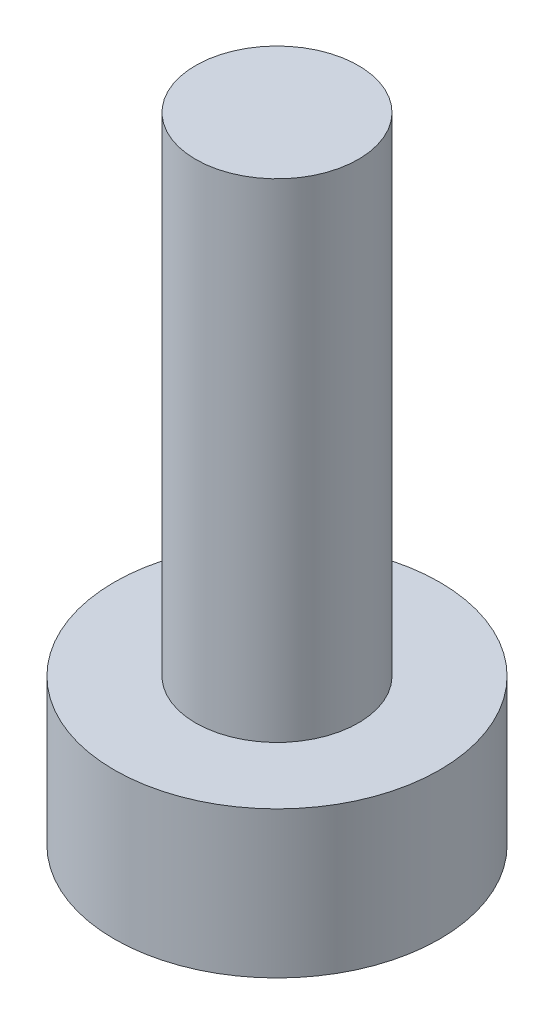
ISO-10303-21;
HEADER;
FILE_DESCRIPTION(('STEP AP214'),'2;1');
FILE_NAME('part.step','',(''),(''),'','','');
FILE_SCHEMA(('AUTOMOTIVE_DESIGN { 1 0 10303 214 1 1 1 1 }'));
ENDSEC;
DATA;
#1=APPLICATION_CONTEXT('core data for automotive mechanical design processes');
#2=APPLICATION_PROTOCOL_DEFINITION('international standard','automotive_design',2000,#1);
#3=PRODUCT_CONTEXT('',#1,'mechanical');
#4=PRODUCT('Part','Part','',(#3));
#5=PRODUCT_RELATED_PRODUCT_CATEGORY('part','',(#4));
#6=PRODUCT_DEFINITION_FORMATION('','',#4);
#7=PRODUCT_DEFINITION_CONTEXT('part definition',#1,'design');
#8=PRODUCT_DEFINITION('design','',#6,#7);
#9=PRODUCT_DEFINITION_SHAPE('','',#8);
#10=(LENGTH_UNIT() NAMED_UNIT(*) SI_UNIT(.MILLI.,.METRE.));
#11=(NAMED_UNIT(*) PLANE_ANGLE_UNIT() SI_UNIT($,.RADIAN.));
#12=(NAMED_UNIT(*) SI_UNIT($,.STERADIAN.) SOLID_ANGLE_UNIT());
#13=UNCERTAINTY_MEASURE_WITH_UNIT(LENGTH_MEASURE(1.E-05),#10,'distance_accuracy_value','');
#14=(GEOMETRIC_REPRESENTATION_CONTEXT(3) GLOBAL_UNCERTAINTY_ASSIGNED_CONTEXT((#13)) GLOBAL_UNIT_ASSIGNED_CONTEXT((#10,
#11,#12)) REPRESENTATION_CONTEXT('',''));
#15=CARTESIAN_POINT('',(0.,0.,0.));
#16=DIRECTION('',(0.,0.,1.));
#17=DIRECTION('',(1.,0.,0.));
#18=AXIS2_PLACEMENT_3D('',#15,#16,#17);
#19=CARTESIAN_POINT('',(0.,2.7,0.));
#20=DIRECTION('',(0.,-1.,0.));
#21=DIRECTION('',(0.,0.,-1.));
#22=AXIS2_PLACEMENT_3D('',#19,#20,#21);
#23=CYLINDRICAL_SURFACE('',#22,3.);
#24=CARTESIAN_POINT('',(0.,2.7,0.));
#25=DIRECTION('',(0.,1.,0.));
#26=DIRECTION('',(0.,0.,1.));
#27=AXIS2_PLACEMENT_3D('',#24,#25,#26);
#28=CIRCLE('',#27,3.);
#29=CARTESIAN_POINT('',(0.,2.7,-3.));
#30=VERTEX_POINT('',#29);
#31=EDGE_CURVE('E45',#30,#30,#28,.T.);
#32=CARTESIAN_POINT('',(0.,0.,0.));
#33=DIRECTION('',(0.,1.,0.));
#34=DIRECTION('',(0.,0.,1.));
#35=AXIS2_PLACEMENT_3D('',#32,#33,#34);
#36=CIRCLE('',#35,3.);
#37=CARTESIAN_POINT('',(0.,0.,-3.));
#38=VERTEX_POINT('',#37);
#39=EDGE_CURVE('E40',#38,#38,#36,.T.);
#40=CARTESIAN_POINT('',(0.,2.7,-3.));
#41=CARTESIAN_POINT('',(0.,2.671875,-3.));
#42=CARTESIAN_POINT('',(0.,2.64375,-3.));
#43=CARTESIAN_POINT('',(0.,2.5875,-3.));
#44=CARTESIAN_POINT('',(0.,2.559375,-3.));
#45=CARTESIAN_POINT('',(0.,2.503125,-3.));
#46=CARTESIAN_POINT('',(0.,2.475,-3.));
#47=CARTESIAN_POINT('',(0.,2.41875,-3.));
#48=CARTESIAN_POINT('',(0.,2.390625,-3.));
#49=CARTESIAN_POINT('',(0.,2.334375,-3.));
#50=CARTESIAN_POINT('',(0.,2.30625,-3.));
#51=CARTESIAN_POINT('',(0.,2.25,-3.));
#52=CARTESIAN_POINT('',(0.,2.221875,-3.));
#53=CARTESIAN_POINT('',(0.,2.165625,-3.));
#54=CARTESIAN_POINT('',(0.,2.1375,-3.));
#55=CARTESIAN_POINT('',(0.,2.08125,-3.));
#56=CARTESIAN_POINT('',(0.,2.053125,-3.));
#57=CARTESIAN_POINT('',(0.,1.996875,-3.));
#58=CARTESIAN_POINT('',(0.,1.96875,-3.));
#59=CARTESIAN_POINT('',(0.,1.9125,-3.));
#60=CARTESIAN_POINT('',(0.,1.884375,-3.));
#61=CARTESIAN_POINT('',(0.,1.828125,-3.));
#62=CARTESIAN_POINT('',(0.,1.8,-3.));
#63=CARTESIAN_POINT('',(0.,1.74375,-3.));
#64=CARTESIAN_POINT('',(0.,1.715625,-3.));
#65=CARTESIAN_POINT('',(0.,1.659375,-3.));
#66=CARTESIAN_POINT('',(0.,1.63125,-3.));
#67=CARTESIAN_POINT('',(0.,1.575,-3.));
#68=CARTESIAN_POINT('',(0.,1.546875,-3.));
#69=CARTESIAN_POINT('',(0.,1.490625,-3.));
#70=CARTESIAN_POINT('',(0.,1.4625,-3.));
#71=CARTESIAN_POINT('',(0.,1.40625,-3.));
#72=CARTESIAN_POINT('',(0.,1.378125,-3.));
#73=CARTESIAN_POINT('',(0.,1.321875,-3.));
#74=CARTESIAN_POINT('',(0.,1.29375,-3.));
#75=CARTESIAN_POINT('',(0.,1.2375,-3.));
#76=CARTESIAN_POINT('',(0.,1.209375,-3.));
#77=CARTESIAN_POINT('',(0.,1.153125,-3.));
#78=CARTESIAN_POINT('',(0.,1.125,-3.));
#79=CARTESIAN_POINT('',(0.,1.06875,-3.));
#80=CARTESIAN_POINT('',(0.,1.040625,-3.));
#81=CARTESIAN_POINT('',(0.,0.984375,-3.));
#82=CARTESIAN_POINT('',(0.,0.95625,-3.));
#83=CARTESIAN_POINT('',(0.,0.9,-3.));
#84=CARTESIAN_POINT('',(0.,0.871875,-3.));
#85=CARTESIAN_POINT('',(0.,0.815625,-3.));
#86=CARTESIAN_POINT('',(0.,0.7875,-3.));
#87=CARTESIAN_POINT('',(0.,0.73125,-3.));
#88=CARTESIAN_POINT('',(0.,0.703125,-3.));
#89=CARTESIAN_POINT('',(0.,0.646875,-3.));
#90=CARTESIAN_POINT('',(0.,0.61875,-3.));
#91=CARTESIAN_POINT('',(0.,0.5625,-3.));
#92=CARTESIAN_POINT('',(0.,0.534375,-3.));
#93=CARTESIAN_POINT('',(0.,0.478125,-3.));
#94=CARTESIAN_POINT('',(0.,0.45,-3.));
#95=CARTESIAN_POINT('',(0.,0.39375,-3.));
#96=CARTESIAN_POINT('',(0.,0.365625,-3.));
#97=CARTESIAN_POINT('',(0.,0.309375,-3.));
#98=CARTESIAN_POINT('',(0.,0.28125,-3.));
#99=CARTESIAN_POINT('',(0.,0.225,-3.));
#100=CARTESIAN_POINT('',(0.,0.196875,-3.));
#101=CARTESIAN_POINT('',(0.,0.140625,-3.));
#102=CARTESIAN_POINT('',(0.,0.112499999999999,-3.));
#103=CARTESIAN_POINT('',(0.,0.0562499999999994,-3.));
#104=CARTESIAN_POINT('',(0.,0.0281249999999995,-3.));
#105=CARTESIAN_POINT('',(0.,0.,-3.));
#106=B_SPLINE_CURVE_WITH_KNOTS('',3,(#40,#41,#42,#43,#44,#45,#46,#47,#48,#49,#50,#51,#52,#53,
#54,#55,#56,#57,#58,#59,#60,#61,#62,#63,#64,#65,#66,#67,#68,#69,#70,#71,#72,#73,#74,#75,#76,#77,
#78,#79,#80,#81,#82,#83,#84,#85,#86,#87,#88,#89,#90,#91,#92,#93,#94,#95,#96,#97,#98,#99,#100,
#101,#102,#103,#104,#105),.UNSPECIFIED.,.F.,.F.,(4,2,2,2,2,2,2,2,2,2,2,2,2,2,2,2,2,2,2,2,2,2,2,
2,2,2,2,2,2,2,2,2,4),(0.,0.0843749999999998,0.16875,0.253125,0.3375,0.421875,0.50625,0.590625,
0.675,0.759375,0.84375,0.928125,1.0125,1.096875,1.18125,1.265625,1.35,1.434375,1.51875,1.603125,
1.6875,1.771875,1.85625,1.940625,2.025,2.109375,2.19375,2.278125,2.3625,2.446875,2.53125,
2.615625,2.7),.UNSPECIFIED.);
#107=EDGE_CURVE('BSEAM37',#30,#38,#106,.T.);
#108=ORIENTED_EDGE('',*,*,#31,.F.);
#109=ORIENTED_EDGE('',*,*,#39,.T.);
#110=ORIENTED_EDGE('',*,*,#107,.T.);
#111=ORIENTED_EDGE('',*,*,#107,.F.);
#112=EDGE_LOOP('',(#108,#110,#109,#111));
#113=FACE_BOUND('',#112,.T.);
#114=ADVANCED_FACE('F37',(#113),#23,.T.);
#115=CARTESIAN_POINT('',(0.,2.7,0.));
#116=DIRECTION('',(0.,1.,0.));
#117=DIRECTION('',(0.,0.,1.));
#118=AXIS2_PLACEMENT_3D('',#115,#116,#117);
#119=PLANE('',#118);
#120=CARTESIAN_POINT('',(0.,2.7,0.));
#121=DIRECTION('',(0.,1.,0.));
#122=DIRECTION('',(0.,0.,1.));
#123=AXIS2_PLACEMENT_3D('',#120,#121,#122);
#124=CIRCLE('',#123,1.5);
#125=CARTESIAN_POINT('',(0.,2.7,1.5));
#126=VERTEX_POINT('',#125);
#127=EDGE_CURVE('E10',#126,#126,#124,.T.);
#128=ORIENTED_EDGE('',*,*,#127,.F.);
#129=EDGE_LOOP('',(#128));
#130=FACE_BOUND('',#129,.T.);
#131=ORIENTED_EDGE('',*,*,#31,.T.);
#132=EDGE_LOOP('',(#131));
#133=FACE_BOUND('',#132,.T.);
#134=ADVANCED_FACE('F65',(#130,#133),#119,.T.);
#135=CARTESIAN_POINT('',(0.,0.,0.));
#136=DIRECTION('',(0.,1.,0.));
#137=DIRECTION('',(0.,0.,1.));
#138=AXIS2_PLACEMENT_3D('',#135,#136,#137);
#139=PLANE('',#138);
#140=ORIENTED_EDGE('',*,*,#39,.F.);
#141=EDGE_LOOP('',(#140));
#142=FACE_BOUND('',#141,.T.);
#143=ADVANCED_FACE('F62',(#142),#139,.F.);
#144=CARTESIAN_POINT('',(0.,11.7,0.));
#145=DIRECTION('',(0.,-1.,0.));
#146=DIRECTION('',(0.,0.,-1.));
#147=AXIS2_PLACEMENT_3D('',#144,#145,#146);
#148=CYLINDRICAL_SURFACE('',#147,1.5);
#149=CARTESIAN_POINT('',(0.,11.7,0.));
#150=DIRECTION('',(0.,1.,0.));
#151=DIRECTION('',(0.,0.,1.));
#152=AXIS2_PLACEMENT_3D('',#149,#150,#151);
#153=CIRCLE('',#152,1.5);
#154=CARTESIAN_POINT('',(0.,11.7,1.5));
#155=VERTEX_POINT('',#154);
#156=EDGE_CURVE('E52',#155,#155,#153,.T.);
#157=ORIENTED_EDGE('',*,*,#156,.F.);
#158=EDGE_LOOP('',(#157));
#159=FACE_BOUND('',#158,.T.);
#160=ORIENTED_EDGE('',*,*,#127,.T.);
#161=EDGE_LOOP('',(#160));
#162=FACE_BOUND('',#161,.T.);
#163=ADVANCED_FACE('F64',(#159,#162),#148,.T.);
#164=CARTESIAN_POINT('',(0.,11.7,0.));
#165=DIRECTION('',(0.,1.,0.));
#166=DIRECTION('',(0.,0.,1.));
#167=AXIS2_PLACEMENT_3D('',#164,#165,#166);
#168=PLANE('',#167);
#169=ORIENTED_EDGE('',*,*,#156,.T.);
#170=EDGE_LOOP('',(#169));
#171=FACE_BOUND('',#170,.T.);
#172=ADVANCED_FACE('F70',(#171),#168,.T.);
#173=CLOSED_SHELL('',(#114,#134,#143,#163,#172));
#174=MANIFOLD_SOLID_BREP('B2',#173);
#175=ADVANCED_BREP_SHAPE_REPRESENTATION('',(#18,#174),#14);
#176=SHAPE_DEFINITION_REPRESENTATION(#9,#175);
ENDSEC;
END-ISO-10303-21;
